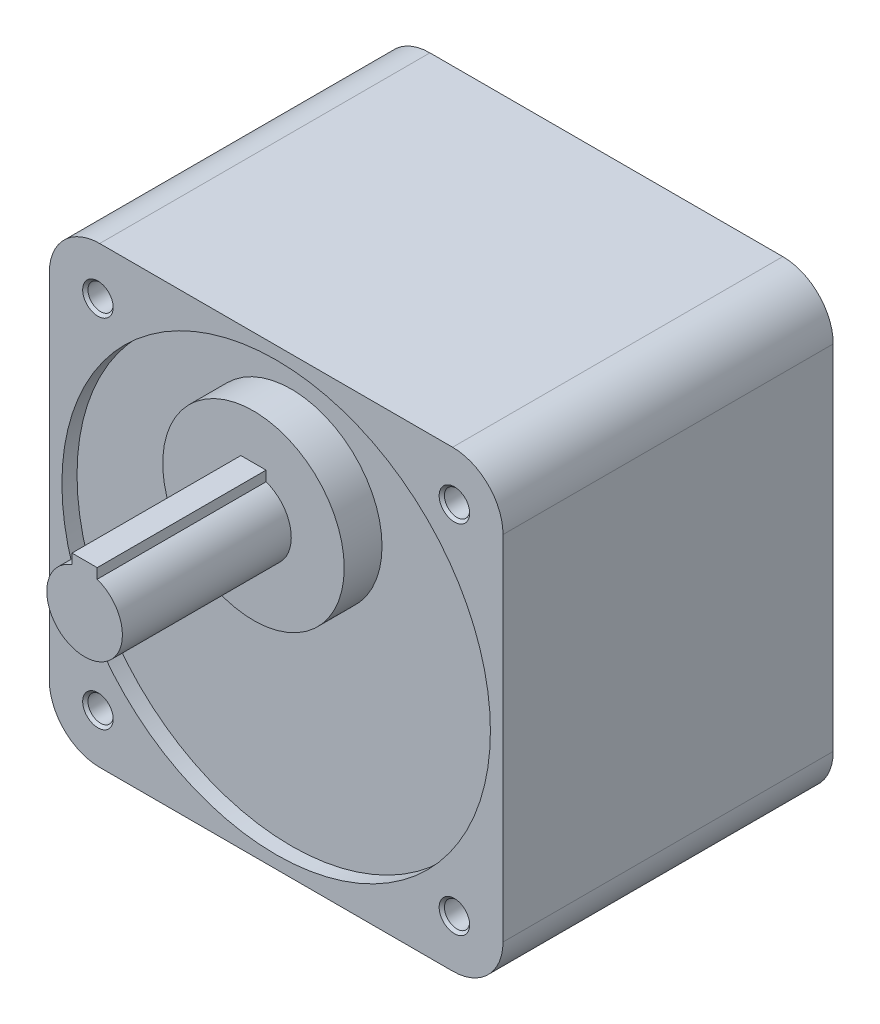
ISO-10303-21;
HEADER;
FILE_DESCRIPTION(('STEP AP214'),'2;1');
FILE_NAME('part.step','',(''),(''),'','','');
FILE_SCHEMA(('AUTOMOTIVE_DESIGN { 1 0 10303 214 1 1 1 1 }'));
ENDSEC;
DATA;
#1=APPLICATION_CONTEXT('core data for automotive mechanical design processes');
#2=APPLICATION_PROTOCOL_DEFINITION('international standard','automotive_design',2000,#1);
#3=PRODUCT_CONTEXT('',#1,'mechanical');
#4=PRODUCT('Part','Part','',(#3));
#5=PRODUCT_RELATED_PRODUCT_CATEGORY('part','',(#4));
#6=PRODUCT_DEFINITION_FORMATION('','',#4);
#7=PRODUCT_DEFINITION_CONTEXT('part definition',#1,'design');
#8=PRODUCT_DEFINITION('design','',#6,#7);
#9=PRODUCT_DEFINITION_SHAPE('','',#8);
#10=(LENGTH_UNIT() NAMED_UNIT(*) SI_UNIT(.MILLI.,.METRE.));
#11=(NAMED_UNIT(*) PLANE_ANGLE_UNIT() SI_UNIT($,.RADIAN.));
#12=(NAMED_UNIT(*) SI_UNIT($,.STERADIAN.) SOLID_ANGLE_UNIT());
#13=UNCERTAINTY_MEASURE_WITH_UNIT(LENGTH_MEASURE(1.E-05),#10,'distance_accuracy_value','');
#14=(GEOMETRIC_REPRESENTATION_CONTEXT(3) GLOBAL_UNCERTAINTY_ASSIGNED_CONTEXT((#13)) GLOBAL_UNIT_ASSIGNED_CONTEXT((#10,
#11,#12)) REPRESENTATION_CONTEXT('',''));
#15=CARTESIAN_POINT('',(0.,0.,0.));
#16=DIRECTION('',(0.,0.,1.));
#17=DIRECTION('',(1.,0.,0.));
#18=AXIS2_PLACEMENT_3D('',#15,#16,#17);
#19=CARTESIAN_POINT('',(0.,0.,65.5));
#20=DIRECTION('',(1.,0.,0.));
#21=DIRECTION('',(0.,1.,0.));
#22=AXIS2_PLACEMENT_3D('',#19,#20,#21);
#23=PLANE('',#22);
#24=DIRECTION('',(0.,-1.,0.));
#25=VECTOR('',#24,1.);
#26=CARTESIAN_POINT('',(0.,0.,0.));
#27=LINE('',#26,#25);
#28=CARTESIAN_POINT('',(0.,-10.,0.));
#29=VERTEX_POINT('',#28);
#30=CARTESIAN_POINT('',(0.,-80.,0.));
#31=VERTEX_POINT('',#30);
#32=EDGE_CURVE('E283',#29,#31,#27,.T.);
#33=ORIENTED_EDGE('',*,*,#32,.T.);
#34=DIRECTION('',(0.,0.,-1.));
#35=VECTOR('',#34,1.);
#36=CARTESIAN_POINT('',(0.,-80.,65.5));
#37=LINE('',#36,#35);
#38=CARTESIAN_POINT('',(0.,-80.,65.5));
#39=VERTEX_POINT('',#38);
#40=EDGE_CURVE('E332',#31,#39,#37,.F.);
#41=ORIENTED_EDGE('',*,*,#40,.T.);
#42=DIRECTION('',(0.,-1.,0.));
#43=VECTOR('',#42,1.);
#44=CARTESIAN_POINT('',(0.,0.,65.5));
#45=LINE('',#44,#43);
#46=CARTESIAN_POINT('',(0.,-10.,65.5));
#47=VERTEX_POINT('',#46);
#48=EDGE_CURVE('E286',#47,#39,#45,.T.);
#49=ORIENTED_EDGE('',*,*,#48,.F.);
#50=DIRECTION('',(0.,0.,-1.));
#51=VECTOR('',#50,1.);
#52=CARTESIAN_POINT('',(0.,-10.,65.5));
#53=LINE('',#52,#51);
#54=EDGE_CURVE('E329',#47,#29,#53,.T.);
#55=ORIENTED_EDGE('',*,*,#54,.T.);
#56=EDGE_LOOP('',(#33,#41,#49,#55));
#57=FACE_BOUND('',#56,.T.);
#58=ADVANCED_FACE('F46',(#57),#23,.F.);
#59=CARTESIAN_POINT('',(0.,-90.,65.5));
#60=DIRECTION('',(0.,1.,0.));
#61=DIRECTION('',(0.,0.,1.));
#62=AXIS2_PLACEMENT_3D('',#59,#60,#61);
#63=PLANE('',#62);
#64=DIRECTION('',(1.,0.,0.));
#65=VECTOR('',#64,1.);
#66=CARTESIAN_POINT('',(0.,-90.,0.));
#67=LINE('',#66,#65);
#68=CARTESIAN_POINT('',(10.,-90.,0.));
#69=VERTEX_POINT('',#68);
#70=CARTESIAN_POINT('',(80.,-90.,0.));
#71=VERTEX_POINT('',#70);
#72=EDGE_CURVE('E298',#69,#71,#67,.T.);
#73=ORIENTED_EDGE('',*,*,#72,.T.);
#74=DIRECTION('',(0.,0.,-1.));
#75=VECTOR('',#74,1.);
#76=CARTESIAN_POINT('',(80.,-90.,65.5));
#77=LINE('',#76,#75);
#78=CARTESIAN_POINT('',(80.,-90.,65.5));
#79=VERTEX_POINT('',#78);
#80=EDGE_CURVE('E320',#71,#79,#77,.F.);
#81=ORIENTED_EDGE('',*,*,#80,.T.);
#82=DIRECTION('',(1.,0.,0.));
#83=VECTOR('',#82,1.);
#84=CARTESIAN_POINT('',(0.,-90.,65.5));
#85=LINE('',#84,#83);
#86=CARTESIAN_POINT('',(10.,-90.,65.5));
#87=VERTEX_POINT('',#86);
#88=EDGE_CURVE('E289',#87,#79,#85,.T.);
#89=ORIENTED_EDGE('',*,*,#88,.F.);
#90=DIRECTION('',(0.,0.,-1.));
#91=VECTOR('',#90,1.);
#92=CARTESIAN_POINT('',(10.,-90.,65.5));
#93=LINE('',#92,#91);
#94=EDGE_CURVE('E317',#87,#69,#93,.T.);
#95=ORIENTED_EDGE('',*,*,#94,.T.);
#96=EDGE_LOOP('',(#73,#81,#89,#95));
#97=FACE_BOUND('',#96,.T.);
#98=ADVANCED_FACE('F347',(#97),#63,.F.);
#99=CARTESIAN_POINT('',(90.,0.,65.5));
#100=DIRECTION('',(-1.,0.,0.));
#101=DIRECTION('',(0.,-1.,0.));
#102=AXIS2_PLACEMENT_3D('',#99,#100,#101);
#103=PLANE('',#102);
#104=DIRECTION('',(0.,1.,0.));
#105=VECTOR('',#104,1.);
#106=CARTESIAN_POINT('',(90.,0.,65.5));
#107=LINE('',#106,#105);
#108=CARTESIAN_POINT('',(90.,-80.,65.5));
#109=VERTEX_POINT('',#108);
#110=CARTESIAN_POINT('',(90.,-9.99999999999999,65.5));
#111=VERTEX_POINT('',#110);
#112=EDGE_CURVE('E293',#109,#111,#107,.T.);
#113=ORIENTED_EDGE('',*,*,#112,.F.);
#114=DIRECTION('',(0.,0.,-1.));
#115=VECTOR('',#114,1.);
#116=CARTESIAN_POINT('',(90.,-80.,65.5));
#117=LINE('',#116,#115);
#118=CARTESIAN_POINT('',(90.,-80.,0.));
#119=VERTEX_POINT('',#118);
#120=EDGE_CURVE('E306',#109,#119,#117,.T.);
#121=ORIENTED_EDGE('',*,*,#120,.T.);
#122=DIRECTION('',(0.,1.,0.));
#123=VECTOR('',#122,1.);
#124=CARTESIAN_POINT('',(90.,0.,0.));
#125=LINE('',#124,#123);
#126=CARTESIAN_POINT('',(90.,-9.99999999999999,0.));
#127=VERTEX_POINT('',#126);
#128=EDGE_CURVE('E301',#119,#127,#125,.T.);
#129=ORIENTED_EDGE('',*,*,#128,.T.);
#130=DIRECTION('',(0.,0.,-1.));
#131=VECTOR('',#130,1.);
#132=CARTESIAN_POINT('',(90.,-10.,65.5));
#133=LINE('',#132,#131);
#134=EDGE_CURVE('E272',#127,#111,#133,.F.);
#135=ORIENTED_EDGE('',*,*,#134,.T.);
#136=EDGE_LOOP('',(#113,#121,#129,#135));
#137=FACE_BOUND('',#136,.T.);
#138=ADVANCED_FACE('F358',(#137),#103,.F.);
#139=CARTESIAN_POINT('',(0.,0.,65.5));
#140=DIRECTION('',(0.,-1.,0.));
#141=DIRECTION('',(0.,0.,-1.));
#142=AXIS2_PLACEMENT_3D('',#139,#140,#141);
#143=PLANE('',#142);
#144=DIRECTION('',(-1.,0.,0.));
#145=VECTOR('',#144,1.);
#146=CARTESIAN_POINT('',(0.,0.,65.5));
#147=LINE('',#146,#145);
#148=CARTESIAN_POINT('',(80.,0.,65.5));
#149=VERTEX_POINT('',#148);
#150=CARTESIAN_POINT('',(10.,0.,65.5));
#151=VERTEX_POINT('',#150);
#152=EDGE_CURVE('E273',#149,#151,#147,.T.);
#153=ORIENTED_EDGE('',*,*,#152,.F.);
#154=DIRECTION('',(0.,0.,-1.));
#155=VECTOR('',#154,1.);
#156=CARTESIAN_POINT('',(80.,0.,65.5));
#157=LINE('',#156,#155);
#158=CARTESIAN_POINT('',(80.,0.,0.));
#159=VERTEX_POINT('',#158);
#160=EDGE_CURVE('E11',#149,#159,#157,.T.);
#161=ORIENTED_EDGE('',*,*,#160,.T.);
#162=DIRECTION('',(-1.,0.,0.));
#163=VECTOR('',#162,1.);
#164=CARTESIAN_POINT('',(0.,0.,0.));
#165=LINE('',#164,#163);
#166=CARTESIAN_POINT('',(10.,0.,0.));
#167=VERTEX_POINT('',#166);
#168=EDGE_CURVE('E290',#159,#167,#165,.T.);
#169=ORIENTED_EDGE('',*,*,#168,.T.);
#170=DIRECTION('',(0.,0.,-1.));
#171=VECTOR('',#170,1.);
#172=CARTESIAN_POINT('',(10.,0.,65.5));
#173=LINE('',#172,#171);
#174=EDGE_CURVE('E54',#167,#151,#173,.F.);
#175=ORIENTED_EDGE('',*,*,#174,.T.);
#176=EDGE_LOOP('',(#153,#161,#169,#175));
#177=FACE_BOUND('',#176,.T.);
#178=ADVANCED_FACE('F364',(#177),#143,.F.);
#179=CARTESIAN_POINT('',(0.,0.,65.5));
#180=DIRECTION('',(0.,0.,1.));
#181=DIRECTION('',(1.,0.,0.));
#182=AXIS2_PLACEMENT_3D('',#179,#180,#181);
#183=PLANE('',#182);
#184=CARTESIAN_POINT('',(9.64466094067262,-9.64466094067262,65.5));
#185=DIRECTION('',(0.,0.,1.));
#186=DIRECTION('',(1.,0.,0.));
#187=AXIS2_PLACEMENT_3D('',#184,#185,#186);
#188=CIRCLE('',#187,3.025);
#189=CARTESIAN_POINT('',(12.6696609406726,-9.64466094067262,65.5));
#190=VERTEX_POINT('',#189);
#191=EDGE_CURVE('E202',#190,#190,#188,.T.);
#192=ORIENTED_EDGE('',*,*,#191,.F.);
#193=EDGE_LOOP('',(#192));
#194=FACE_BOUND('',#193,.T.);
#195=CARTESIAN_POINT('',(80.3553390593274,-9.64466094067262,65.5));
#196=DIRECTION('',(0.,0.,1.));
#197=DIRECTION('',(1.,0.,0.));
#198=AXIS2_PLACEMENT_3D('',#195,#196,#197);
#199=CIRCLE('',#198,3.025);
#200=CARTESIAN_POINT('',(83.3803390593274,-9.64466094067262,65.5));
#201=VERTEX_POINT('',#200);
#202=EDGE_CURVE('E211',#201,#201,#199,.T.);
#203=ORIENTED_EDGE('',*,*,#202,.F.);
#204=EDGE_LOOP('',(#203));
#205=FACE_BOUND('',#204,.T.);
#206=CARTESIAN_POINT('',(9.64466094067262,-80.3553390593274,65.5));
#207=DIRECTION('',(0.,0.,1.));
#208=DIRECTION('',(1.,0.,0.));
#209=AXIS2_PLACEMENT_3D('',#206,#207,#208);
#210=CIRCLE('',#209,3.025);
#211=CARTESIAN_POINT('',(12.6696609406726,-80.3553390593274,65.5));
#212=VERTEX_POINT('',#211);
#213=EDGE_CURVE('E220',#212,#212,#210,.T.);
#214=ORIENTED_EDGE('',*,*,#213,.F.);
#215=EDGE_LOOP('',(#214));
#216=FACE_BOUND('',#215,.T.);
#217=CARTESIAN_POINT('',(80.3553390593274,-80.3553390593274,65.5));
#218=DIRECTION('',(0.,0.,1.));
#219=DIRECTION('',(1.,0.,0.));
#220=AXIS2_PLACEMENT_3D('',#217,#218,#219);
#221=CIRCLE('',#220,3.025);
#222=CARTESIAN_POINT('',(83.3803390593274,-80.3553390593274,65.5));
#223=VERTEX_POINT('',#222);
#224=EDGE_CURVE('E229',#223,#223,#221,.T.);
#225=ORIENTED_EDGE('',*,*,#224,.F.);
#226=EDGE_LOOP('',(#225));
#227=FACE_BOUND('',#226,.T.);
#228=CARTESIAN_POINT('',(45.,-45.,65.5));
#229=DIRECTION('',(0.,0.,1.));
#230=DIRECTION('',(1.,0.,0.));
#231=AXIS2_PLACEMENT_3D('',#228,#229,#230);
#232=CIRCLE('',#231,42.5);
#233=CARTESIAN_POINT('',(87.5,-45.,65.5));
#234=VERTEX_POINT('',#233);
#235=EDGE_CURVE('E277',#234,#234,#232,.T.);
#236=ORIENTED_EDGE('',*,*,#235,.F.);
#237=EDGE_LOOP('',(#236));
#238=FACE_BOUND('',#237,.T.);
#239=ORIENTED_EDGE('',*,*,#88,.T.);
#240=CARTESIAN_POINT('',(80.,-80.,65.5));
#241=DIRECTION('',(0.,0.,1.));
#242=DIRECTION('',(1.,0.,0.));
#243=AXIS2_PLACEMENT_3D('',#240,#241,#242);
#244=CIRCLE('',#243,10.);
#245=EDGE_CURVE('E327',#79,#109,#244,.T.);
#246=ORIENTED_EDGE('',*,*,#245,.T.);
#247=ORIENTED_EDGE('',*,*,#112,.T.);
#248=CARTESIAN_POINT('',(80.,-10.,65.5));
#249=DIRECTION('',(0.,0.,1.));
#250=DIRECTION('',(1.,0.,0.));
#251=AXIS2_PLACEMENT_3D('',#248,#249,#250);
#252=CIRCLE('',#251,10.);
#253=EDGE_CURVE('E67',#111,#149,#252,.T.);
#254=ORIENTED_EDGE('',*,*,#253,.T.);
#255=ORIENTED_EDGE('',*,*,#152,.T.);
#256=CARTESIAN_POINT('',(10.,-10.,65.5));
#257=DIRECTION('',(0.,0.,1.));
#258=DIRECTION('',(1.,0.,0.));
#259=AXIS2_PLACEMENT_3D('',#256,#257,#258);
#260=CIRCLE('',#259,10.);
#261=EDGE_CURVE('E322',#151,#47,#260,.T.);
#262=ORIENTED_EDGE('',*,*,#261,.T.);
#263=ORIENTED_EDGE('',*,*,#48,.T.);
#264=CARTESIAN_POINT('',(10.,-80.,65.5));
#265=DIRECTION('',(0.,0.,1.));
#266=DIRECTION('',(1.,0.,0.));
#267=AXIS2_PLACEMENT_3D('',#264,#265,#266);
#268=CIRCLE('',#267,10.);
#269=EDGE_CURVE('E325',#39,#87,#268,.T.);
#270=ORIENTED_EDGE('',*,*,#269,.T.);
#271=EDGE_LOOP('',(#239,#246,#247,#254,#255,#262,#263,#270));
#272=FACE_BOUND('',#271,.T.);
#273=ADVANCED_FACE('F340',(#194,#205,#216,#227,#238,#272),#183,.T.);
#274=CARTESIAN_POINT('',(0.,0.,0.));
#275=DIRECTION('',(0.,0.,1.));
#276=DIRECTION('',(1.,0.,0.));
#277=AXIS2_PLACEMENT_3D('',#274,#275,#276);
#278=PLANE('',#277);
#279=CARTESIAN_POINT('',(80.3135962701083,-9.68640372989193,0.));
#280=DIRECTION('',(0.,0.,-1.));
#281=DIRECTION('',(-1.,0.,0.));
#282=AXIS2_PLACEMENT_3D('',#279,#280,#281);
#283=CIRCLE('',#282,3.025);
#284=CARTESIAN_POINT('',(77.2885962701083,-9.68640372989193,0.));
#285=VERTEX_POINT('',#284);
#286=EDGE_CURVE('E175',#285,#285,#283,.T.);
#287=ORIENTED_EDGE('',*,*,#286,.F.);
#288=EDGE_LOOP('',(#287));
#289=FACE_BOUND('',#288,.T.);
#290=CARTESIAN_POINT('',(9.60296737759219,-9.60296737759219,0.));
#291=DIRECTION('',(0.,0.,-1.));
#292=DIRECTION('',(-1.,0.,0.));
#293=AXIS2_PLACEMENT_3D('',#290,#291,#292);
#294=CIRCLE('',#293,3.025);
#295=CARTESIAN_POINT('',(6.57796737759219,-9.60296737759219,0.));
#296=VERTEX_POINT('',#295);
#297=EDGE_CURVE('E168',#296,#296,#294,.T.);
#298=ORIENTED_EDGE('',*,*,#297,.F.);
#299=EDGE_LOOP('',(#298));
#300=FACE_BOUND('',#299,.T.);
#301=CARTESIAN_POINT('',(80.3135962701082,-80.3135962701081,0.));
#302=DIRECTION('',(0.,0.,-1.));
#303=DIRECTION('',(-1.,0.,0.));
#304=AXIS2_PLACEMENT_3D('',#301,#302,#303);
#305=CIRCLE('',#304,3.025);
#306=CARTESIAN_POINT('',(77.2885962701082,-80.3135962701081,0.));
#307=VERTEX_POINT('',#306);
#308=EDGE_CURVE('E184',#307,#307,#305,.T.);
#309=ORIENTED_EDGE('',*,*,#308,.F.);
#310=EDGE_LOOP('',(#309));
#311=FACE_BOUND('',#310,.T.);
#312=CARTESIAN_POINT('',(9.60296737759221,-80.3970326224078,0.));
#313=DIRECTION('',(0.,0.,-1.));
#314=DIRECTION('',(-1.,0.,0.));
#315=AXIS2_PLACEMENT_3D('',#312,#313,#314);
#316=CIRCLE('',#315,3.025);
#317=CARTESIAN_POINT('',(6.57796737759221,-80.3970326224078,0.));
#318=VERTEX_POINT('',#317);
#319=EDGE_CURVE('E193',#318,#318,#316,.T.);
#320=ORIENTED_EDGE('',*,*,#319,.F.);
#321=EDGE_LOOP('',(#320));
#322=FACE_BOUND('',#321,.T.);
#323=ORIENTED_EDGE('',*,*,#128,.F.);
#324=CARTESIAN_POINT('',(80.,-80.,0.));
#325=DIRECTION('',(0.,0.,1.));
#326=DIRECTION('',(1.,0.,0.));
#327=AXIS2_PLACEMENT_3D('',#324,#325,#326);
#328=CIRCLE('',#327,10.);
#329=EDGE_CURVE('E315',#119,#71,#328,.F.);
#330=ORIENTED_EDGE('',*,*,#329,.T.);
#331=ORIENTED_EDGE('',*,*,#72,.F.);
#332=CARTESIAN_POINT('',(10.,-80.,0.));
#333=DIRECTION('',(0.,0.,1.));
#334=DIRECTION('',(1.,0.,0.));
#335=AXIS2_PLACEMENT_3D('',#332,#333,#334);
#336=CIRCLE('',#335,10.);
#337=EDGE_CURVE('E313',#69,#31,#336,.F.);
#338=ORIENTED_EDGE('',*,*,#337,.T.);
#339=ORIENTED_EDGE('',*,*,#32,.F.);
#340=CARTESIAN_POINT('',(10.,-10.,0.));
#341=DIRECTION('',(0.,0.,1.));
#342=DIRECTION('',(1.,0.,0.));
#343=AXIS2_PLACEMENT_3D('',#340,#341,#342);
#344=CIRCLE('',#343,10.);
#345=EDGE_CURVE('E309',#29,#167,#344,.F.);
#346=ORIENTED_EDGE('',*,*,#345,.T.);
#347=ORIENTED_EDGE('',*,*,#168,.F.);
#348=CARTESIAN_POINT('',(80.,-10.,0.));
#349=DIRECTION('',(0.,0.,1.));
#350=DIRECTION('',(1.,0.,0.));
#351=AXIS2_PLACEMENT_3D('',#348,#349,#350);
#352=CIRCLE('',#351,10.);
#353=EDGE_CURVE('E311',#159,#127,#352,.F.);
#354=ORIENTED_EDGE('',*,*,#353,.T.);
#355=EDGE_LOOP('',(#323,#330,#331,#338,#339,#346,#347,#354));
#356=FACE_BOUND('',#355,.T.);
#357=ADVANCED_FACE('F351',(#289,#300,#311,#322,#356),#278,.F.);
#358=CARTESIAN_POINT('',(45.,-45.,62.5));
#359=DIRECTION('',(0.,0.,1.));
#360=DIRECTION('',(1.,0.,0.));
#361=AXIS2_PLACEMENT_3D('',#358,#359,#360);
#362=CYLINDRICAL_SURFACE('',#361,42.5);
#363=CARTESIAN_POINT('',(45.,-45.,62.5));
#364=DIRECTION('',(0.,0.,1.));
#365=DIRECTION('',(1.,0.,0.));
#366=AXIS2_PLACEMENT_3D('',#363,#364,#365);
#367=CIRCLE('',#366,42.5);
#368=CARTESIAN_POINT('',(87.5,-45.,62.5));
#369=VERTEX_POINT('',#368);
#370=EDGE_CURVE('E280',#369,#369,#367,.T.);
#371=ORIENTED_EDGE('',*,*,#370,.F.);
#372=EDGE_LOOP('',(#371));
#373=FACE_BOUND('',#372,.T.);
#374=ORIENTED_EDGE('',*,*,#235,.T.);
#375=EDGE_LOOP('',(#374));
#376=FACE_BOUND('',#375,.T.);
#377=ADVANCED_FACE('F603',(#373,#376),#362,.F.);
#378=CARTESIAN_POINT('',(45.,-45.,62.5));
#379=DIRECTION('',(0.,0.,1.));
#380=DIRECTION('',(1.,0.,0.));
#381=AXIS2_PLACEMENT_3D('',#378,#379,#380);
#382=PLANE('',#381);
#383=CARTESIAN_POINT('',(45.,-27.,62.5));
#384=DIRECTION('',(0.,0.,1.));
#385=DIRECTION('',(1.,0.,0.));
#386=AXIS2_PLACEMENT_3D('',#383,#384,#385);
#387=CIRCLE('',#386,18.);
#388=CARTESIAN_POINT('',(63.,-27.,62.5));
#389=VERTEX_POINT('',#388);
#390=EDGE_CURVE('E268',#389,#389,#387,.T.);
#391=ORIENTED_EDGE('',*,*,#390,.F.);
#392=EDGE_LOOP('',(#391));
#393=FACE_BOUND('',#392,.T.);
#394=ORIENTED_EDGE('',*,*,#370,.T.);
#395=EDGE_LOOP('',(#394));
#396=FACE_BOUND('',#395,.T.);
#397=ADVANCED_FACE('F599',(#393,#396),#382,.T.);
#398=CARTESIAN_POINT('',(45.,-27.,70.));
#399=DIRECTION('',(0.,0.,-1.));
#400=DIRECTION('',(-1.,0.,0.));
#401=AXIS2_PLACEMENT_3D('',#398,#399,#400);
#402=CYLINDRICAL_SURFACE('',#401,18.);
#403=CARTESIAN_POINT('',(45.,-27.,70.));
#404=DIRECTION('',(0.,0.,1.));
#405=DIRECTION('',(1.,0.,0.));
#406=AXIS2_PLACEMENT_3D('',#403,#404,#405);
#407=CIRCLE('',#406,18.);
#408=CARTESIAN_POINT('',(63.,-27.,70.));
#409=VERTEX_POINT('',#408);
#410=EDGE_CURVE('E274',#409,#409,#407,.T.);
#411=ORIENTED_EDGE('',*,*,#410,.F.);
#412=EDGE_LOOP('',(#411));
#413=FACE_BOUND('',#412,.T.);
#414=ORIENTED_EDGE('',*,*,#390,.T.);
#415=EDGE_LOOP('',(#414));
#416=FACE_BOUND('',#415,.T.);
#417=ADVANCED_FACE('F595',(#413,#416),#402,.T.);
#418=CARTESIAN_POINT('',(45.,-27.,70.));
#419=DIRECTION('',(0.,0.,1.));
#420=DIRECTION('',(1.,0.,0.));
#421=AXIS2_PLACEMENT_3D('',#418,#419,#420);
#422=PLANE('',#421);
#423=DIRECTION('',(0.,1.,0.));
#424=VECTOR('',#423,1.);
#425=CARTESIAN_POINT('',(42.5,-19.9289321881345,70.));
#426=LINE('',#425,#424);
#427=CARTESIAN_POINT('',(42.5,-19.9289321881345,70.));
#428=VERTEX_POINT('',#427);
#429=CARTESIAN_POINT('',(42.5,-17.9289321881345,70.));
#430=VERTEX_POINT('',#429);
#431=EDGE_CURVE('E238',#428,#430,#426,.T.);
#432=ORIENTED_EDGE('',*,*,#431,.T.);
#433=DIRECTION('',(1.,0.,0.));
#434=VECTOR('',#433,1.);
#435=CARTESIAN_POINT('',(42.5,-17.9289321881345,70.));
#436=LINE('',#435,#434);
#437=CARTESIAN_POINT('',(47.5,-17.9289321881345,70.));
#438=VERTEX_POINT('',#437);
#439=EDGE_CURVE('E261',#430,#438,#436,.T.);
#440=ORIENTED_EDGE('',*,*,#439,.T.);
#441=DIRECTION('',(0.,-1.,0.));
#442=VECTOR('',#441,1.);
#443=CARTESIAN_POINT('',(47.5,-19.9289321881345,70.));
#444=LINE('',#443,#442);
#445=CARTESIAN_POINT('',(47.5,-19.9289321881345,70.));
#446=VERTEX_POINT('',#445);
#447=EDGE_CURVE('E253',#438,#446,#444,.T.);
#448=ORIENTED_EDGE('',*,*,#447,.T.);
#449=CARTESIAN_POINT('',(45.,-27.,70.));
#450=DIRECTION('',(0.,0.,1.));
#451=DIRECTION('',(1.,0.,0.));
#452=AXIS2_PLACEMENT_3D('',#449,#450,#451);
#453=CIRCLE('',#452,7.5);
#454=EDGE_CURVE('E269',#428,#446,#453,.T.);
#455=ORIENTED_EDGE('',*,*,#454,.F.);
#456=EDGE_LOOP('',(#432,#440,#448,#455));
#457=FACE_BOUND('',#456,.T.);
#458=ORIENTED_EDGE('',*,*,#410,.T.);
#459=EDGE_LOOP('',(#458));
#460=FACE_BOUND('',#459,.T.);
#461=ADVANCED_FACE('F591',(#457,#460),#422,.T.);
#462=CARTESIAN_POINT('',(45.,-27.,103.5));
#463=DIRECTION('',(0.,0.,-1.));
#464=DIRECTION('',(-1.,0.,0.));
#465=AXIS2_PLACEMENT_3D('',#462,#463,#464);
#466=CYLINDRICAL_SURFACE('',#465,7.5);
#467=CARTESIAN_POINT('',(45.,-27.,103.5));
#468=DIRECTION('',(0.,0.,1.));
#469=DIRECTION('',(1.,0.,0.));
#470=AXIS2_PLACEMENT_3D('',#467,#468,#469);
#471=CIRCLE('',#470,7.5);
#472=CARTESIAN_POINT('',(42.5,-19.9289321881345,103.5));
#473=VERTEX_POINT('',#472);
#474=CARTESIAN_POINT('',(47.5,-19.9289321881345,103.5));
#475=VERTEX_POINT('',#474);
#476=EDGE_CURVE('E241',#473,#475,#471,.T.);
#477=ORIENTED_EDGE('',*,*,#476,.F.);
#478=DIRECTION('',(0.,0.,1.));
#479=VECTOR('',#478,1.);
#480=CARTESIAN_POINT('',(42.5,-19.9289321881345,-0.002000000000002));
#481=LINE('',#480,#479);
#482=EDGE_CURVE('E248',#428,#473,#481,.T.);
#483=ORIENTED_EDGE('',*,*,#482,.F.);
#484=ORIENTED_EDGE('',*,*,#454,.T.);
#485=DIRECTION('',(0.,0.,1.));
#486=VECTOR('',#485,1.);
#487=CARTESIAN_POINT('',(47.5,-19.9289321881345,-0.002000000000002));
#488=LINE('',#487,#486);
#489=EDGE_CURVE('E249',#446,#475,#488,.T.);
#490=ORIENTED_EDGE('',*,*,#489,.T.);
#491=EDGE_LOOP('',(#477,#483,#484,#490));
#492=FACE_BOUND('',#491,.T.);
#493=ADVANCED_FACE('F587',(#492),#466,.T.);
#494=CARTESIAN_POINT('',(45.,-27.,103.5));
#495=DIRECTION('',(0.,0.,1.));
#496=DIRECTION('',(1.,0.,0.));
#497=AXIS2_PLACEMENT_3D('',#494,#495,#496);
#498=PLANE('',#497);
#499=ORIENTED_EDGE('',*,*,#476,.T.);
#500=DIRECTION('',(0.,1.,0.));
#501=VECTOR('',#500,1.);
#502=CARTESIAN_POINT('',(47.5,-19.9289321881345,103.5));
#503=LINE('',#502,#501);
#504=CARTESIAN_POINT('',(47.5,-17.9289321881345,103.5));
#505=VERTEX_POINT('',#504);
#506=EDGE_CURVE('E245',#475,#505,#503,.T.);
#507=ORIENTED_EDGE('',*,*,#506,.T.);
#508=DIRECTION('',(-1.,0.,0.));
#509=VECTOR('',#508,1.);
#510=CARTESIAN_POINT('',(42.5,-17.9289321881345,103.5));
#511=LINE('',#510,#509);
#512=CARTESIAN_POINT('',(42.5,-17.9289321881345,103.5));
#513=VERTEX_POINT('',#512);
#514=EDGE_CURVE('E242',#505,#513,#511,.T.);
#515=ORIENTED_EDGE('',*,*,#514,.T.);
#516=DIRECTION('',(0.,-1.,0.));
#517=VECTOR('',#516,1.);
#518=CARTESIAN_POINT('',(42.5,-19.9289321881345,103.5));
#519=LINE('',#518,#517);
#520=EDGE_CURVE('E239',#513,#473,#519,.T.);
#521=ORIENTED_EDGE('',*,*,#520,.T.);
#522=EDGE_LOOP('',(#499,#507,#515,#521));
#523=FACE_BOUND('',#522,.T.);
#524=ADVANCED_FACE('F578',(#523),#498,.T.);
#525=CARTESIAN_POINT('',(42.5,-19.9289321881345,-0.002000000000002));
#526=DIRECTION('',(-1.,0.,0.));
#527=DIRECTION('',(0.,0.,1.));
#528=AXIS2_PLACEMENT_3D('',#525,#526,#527);
#529=PLANE('',#528);
#530=ORIENTED_EDGE('',*,*,#431,.F.);
#531=ORIENTED_EDGE('',*,*,#482,.T.);
#532=ORIENTED_EDGE('',*,*,#520,.F.);
#533=DIRECTION('',(0.,0.,1.));
#534=VECTOR('',#533,1.);
#535=CARTESIAN_POINT('',(42.5,-17.9289321881345,-0.002000000000002));
#536=LINE('',#535,#534);
#537=EDGE_CURVE('E255',#430,#513,#536,.T.);
#538=ORIENTED_EDGE('',*,*,#537,.F.);
#539=EDGE_LOOP('',(#530,#531,#532,#538));
#540=FACE_BOUND('',#539,.T.);
#541=ADVANCED_FACE('F573',(#540),#529,.T.);
#542=CARTESIAN_POINT('',(42.5,-17.9289321881345,-0.002000000000002));
#543=DIRECTION('',(0.,1.,0.));
#544=DIRECTION('',(0.,0.,1.));
#545=AXIS2_PLACEMENT_3D('',#542,#543,#544);
#546=PLANE('',#545);
#547=ORIENTED_EDGE('',*,*,#439,.F.);
#548=ORIENTED_EDGE('',*,*,#537,.T.);
#549=ORIENTED_EDGE('',*,*,#514,.F.);
#550=DIRECTION('',(0.,0.,1.));
#551=VECTOR('',#550,1.);
#552=CARTESIAN_POINT('',(47.5,-17.9289321881345,-0.002000000000002));
#553=LINE('',#552,#551);
#554=EDGE_CURVE('E252',#438,#505,#553,.T.);
#555=ORIENTED_EDGE('',*,*,#554,.F.);
#556=EDGE_LOOP('',(#547,#548,#549,#555));
#557=FACE_BOUND('',#556,.T.);
#558=ADVANCED_FACE('F576',(#557),#546,.T.);
#559=CARTESIAN_POINT('',(47.5,-19.9289321881345,-0.002000000000002));
#560=DIRECTION('',(1.,0.,0.));
#561=DIRECTION('',(0.,0.,-1.));
#562=AXIS2_PLACEMENT_3D('',#559,#560,#561);
#563=PLANE('',#562);
#564=ORIENTED_EDGE('',*,*,#447,.F.);
#565=ORIENTED_EDGE('',*,*,#554,.T.);
#566=ORIENTED_EDGE('',*,*,#506,.F.);
#567=ORIENTED_EDGE('',*,*,#489,.F.);
#568=EDGE_LOOP('',(#564,#565,#566,#567));
#569=FACE_BOUND('',#568,.T.);
#570=ADVANCED_FACE('F571',(#569),#563,.T.);
#571=CARTESIAN_POINT('',(80.3553390593274,-80.3553390593274,48.5));
#572=DIRECTION('',(0.,0.,1.));
#573=DIRECTION('',(1.,0.,0.));
#574=AXIS2_PLACEMENT_3D('',#571,#572,#573);
#575=CONICAL_SURFACE('',#574,2.49999999999999,1.02974425867665);
#576=CARTESIAN_POINT('',(80.3553390593274,-80.3553390593274,46.9978484524311));
#577=VERTEX_POINT('',#576);
#578=VERTEX_LOOP('',#577);
#579=FACE_BOUND('',#578,.T.);
#580=CARTESIAN_POINT('',(80.3553390593274,-80.3553390593274,48.5));
#581=DIRECTION('',(0.,0.,1.));
#582=DIRECTION('',(1.,0.,0.));
#583=AXIS2_PLACEMENT_3D('',#580,#581,#582);
#584=CIRCLE('',#583,2.49999999999999);
#585=CARTESIAN_POINT('',(82.8553390593274,-80.3553390593274,48.5));
#586=VERTEX_POINT('',#585);
#587=EDGE_CURVE('E235',#586,#586,#584,.T.);
#588=ORIENTED_EDGE('',*,*,#587,.T.);
#589=EDGE_LOOP('',(#588));
#590=FACE_BOUND('',#589,.T.);
#591=ADVANCED_FACE('F567',(#579,#590),#575,.F.);
#592=CARTESIAN_POINT('',(80.3553390593274,-80.3553390593274,65.5));
#593=DIRECTION('',(0.,0.,1.));
#594=DIRECTION('',(1.,0.,0.));
#595=AXIS2_PLACEMENT_3D('',#592,#593,#594);
#596=CYLINDRICAL_SURFACE('',#595,2.5);
#597=ORIENTED_EDGE('',*,*,#587,.F.);
#598=EDGE_LOOP('',(#597));
#599=FACE_BOUND('',#598,.T.);
#600=CARTESIAN_POINT('',(80.3553390593274,-80.3553390593274,64.975));
#601=DIRECTION('',(0.,0.,1.));
#602=DIRECTION('',(1.,0.,0.));
#603=AXIS2_PLACEMENT_3D('',#600,#601,#602);
#604=CIRCLE('',#603,2.5);
#605=CARTESIAN_POINT('',(82.8553390593274,-80.3553390593274,64.975));
#606=VERTEX_POINT('',#605);
#607=EDGE_CURVE('E232',#606,#606,#604,.T.);
#608=ORIENTED_EDGE('',*,*,#607,.T.);
#609=EDGE_LOOP('',(#608));
#610=FACE_BOUND('',#609,.T.);
#611=ADVANCED_FACE('F563',(#599,#610),#596,.F.);
#612=CARTESIAN_POINT('',(80.3553390593274,-80.3553390593274,65.5));
#613=DIRECTION('',(0.,0.,1.));
#614=DIRECTION('',(1.,0.,0.));
#615=AXIS2_PLACEMENT_3D('',#612,#613,#614);
#616=CONICAL_SURFACE('',#615,3.025,0.785398163397448);
#617=ORIENTED_EDGE('',*,*,#607,.F.);
#618=EDGE_LOOP('',(#617));
#619=FACE_BOUND('',#618,.T.);
#620=ORIENTED_EDGE('',*,*,#224,.T.);
#621=EDGE_LOOP('',(#620));
#622=FACE_BOUND('',#621,.T.);
#623=ADVANCED_FACE('F559',(#619,#622),#616,.F.);
#624=CARTESIAN_POINT('',(9.64466094067262,-80.3553390593274,48.5));
#625=DIRECTION('',(0.,0.,1.));
#626=DIRECTION('',(1.,0.,0.));
#627=AXIS2_PLACEMENT_3D('',#624,#625,#626);
#628=CONICAL_SURFACE('',#627,2.49999999999999,1.02974425867665);
#629=CARTESIAN_POINT('',(9.64466094067262,-80.3553390593274,46.9978484524311));
#630=VERTEX_POINT('',#629);
#631=VERTEX_LOOP('',#630);
#632=FACE_BOUND('',#631,.T.);
#633=CARTESIAN_POINT('',(9.64466094067262,-80.3553390593274,48.5));
#634=DIRECTION('',(0.,0.,1.));
#635=DIRECTION('',(1.,0.,0.));
#636=AXIS2_PLACEMENT_3D('',#633,#634,#635);
#637=CIRCLE('',#636,2.49999999999999);
#638=CARTESIAN_POINT('',(12.1446609406726,-80.3553390593274,48.5));
#639=VERTEX_POINT('',#638);
#640=EDGE_CURVE('E226',#639,#639,#637,.T.);
#641=ORIENTED_EDGE('',*,*,#640,.T.);
#642=EDGE_LOOP('',(#641));
#643=FACE_BOUND('',#642,.T.);
#644=ADVANCED_FACE('F555',(#632,#643),#628,.F.);
#645=CARTESIAN_POINT('',(9.64466094067262,-80.3553390593274,65.5));
#646=DIRECTION('',(0.,0.,1.));
#647=DIRECTION('',(1.,0.,0.));
#648=AXIS2_PLACEMENT_3D('',#645,#646,#647);
#649=CYLINDRICAL_SURFACE('',#648,2.49999999999999);
#650=ORIENTED_EDGE('',*,*,#640,.F.);
#651=EDGE_LOOP('',(#650));
#652=FACE_BOUND('',#651,.T.);
#653=CARTESIAN_POINT('',(9.64466094067262,-80.3553390593274,64.975));
#654=DIRECTION('',(0.,0.,1.));
#655=DIRECTION('',(1.,0.,0.));
#656=AXIS2_PLACEMENT_3D('',#653,#654,#655);
#657=CIRCLE('',#656,2.5);
#658=CARTESIAN_POINT('',(12.1446609406726,-80.3553390593274,64.975));
#659=VERTEX_POINT('',#658);
#660=EDGE_CURVE('E223',#659,#659,#657,.T.);
#661=ORIENTED_EDGE('',*,*,#660,.T.);
#662=EDGE_LOOP('',(#661));
#663=FACE_BOUND('',#662,.T.);
#664=ADVANCED_FACE('F551',(#652,#663),#649,.F.);
#665=CARTESIAN_POINT('',(9.64466094067262,-80.3553390593274,65.5));
#666=DIRECTION('',(0.,0.,1.));
#667=DIRECTION('',(1.,0.,0.));
#668=AXIS2_PLACEMENT_3D('',#665,#666,#667);
#669=CONICAL_SURFACE('',#668,3.025,0.785398163397452);
#670=ORIENTED_EDGE('',*,*,#660,.F.);
#671=EDGE_LOOP('',(#670));
#672=FACE_BOUND('',#671,.T.);
#673=ORIENTED_EDGE('',*,*,#213,.T.);
#674=EDGE_LOOP('',(#673));
#675=FACE_BOUND('',#674,.T.);
#676=ADVANCED_FACE('F547',(#672,#675),#669,.F.);
#677=CARTESIAN_POINT('',(80.3553390593274,-9.64466094067262,48.5));
#678=DIRECTION('',(0.,0.,1.));
#679=DIRECTION('',(1.,0.,0.));
#680=AXIS2_PLACEMENT_3D('',#677,#678,#679);
#681=CONICAL_SURFACE('',#680,2.49999999999999,1.02974425867665);
#682=CARTESIAN_POINT('',(80.3553390593274,-9.64466094067262,46.9978484524311));
#683=VERTEX_POINT('',#682);
#684=VERTEX_LOOP('',#683);
#685=FACE_BOUND('',#684,.T.);
#686=CARTESIAN_POINT('',(80.3553390593274,-9.64466094067262,48.5));
#687=DIRECTION('',(0.,0.,1.));
#688=DIRECTION('',(1.,0.,0.));
#689=AXIS2_PLACEMENT_3D('',#686,#687,#688);
#690=CIRCLE('',#689,2.49999999999999);
#691=CARTESIAN_POINT('',(82.8553390593274,-9.64466094067262,48.5));
#692=VERTEX_POINT('',#691);
#693=EDGE_CURVE('E217',#692,#692,#690,.T.);
#694=ORIENTED_EDGE('',*,*,#693,.T.);
#695=EDGE_LOOP('',(#694));
#696=FACE_BOUND('',#695,.T.);
#697=ADVANCED_FACE('F543',(#685,#696),#681,.F.);
#698=CARTESIAN_POINT('',(80.3553390593274,-9.64466094067262,65.5));
#699=DIRECTION('',(0.,0.,1.));
#700=DIRECTION('',(1.,0.,0.));
#701=AXIS2_PLACEMENT_3D('',#698,#699,#700);
#702=CYLINDRICAL_SURFACE('',#701,2.5);
#703=ORIENTED_EDGE('',*,*,#693,.F.);
#704=EDGE_LOOP('',(#703));
#705=FACE_BOUND('',#704,.T.);
#706=CARTESIAN_POINT('',(80.3553390593274,-9.64466094067262,64.975));
#707=DIRECTION('',(0.,0.,1.));
#708=DIRECTION('',(1.,0.,0.));
#709=AXIS2_PLACEMENT_3D('',#706,#707,#708);
#710=CIRCLE('',#709,2.5);
#711=CARTESIAN_POINT('',(82.8553390593274,-9.64466094067262,64.975));
#712=VERTEX_POINT('',#711);
#713=EDGE_CURVE('E214',#712,#712,#710,.T.);
#714=ORIENTED_EDGE('',*,*,#713,.T.);
#715=EDGE_LOOP('',(#714));
#716=FACE_BOUND('',#715,.T.);
#717=ADVANCED_FACE('F539',(#705,#716),#702,.F.);
#718=CARTESIAN_POINT('',(80.3553390593274,-9.64466094067262,65.5));
#719=DIRECTION('',(0.,0.,1.));
#720=DIRECTION('',(1.,0.,0.));
#721=AXIS2_PLACEMENT_3D('',#718,#719,#720);
#722=CONICAL_SURFACE('',#721,3.025,0.785398163397448);
#723=ORIENTED_EDGE('',*,*,#713,.F.);
#724=EDGE_LOOP('',(#723));
#725=FACE_BOUND('',#724,.T.);
#726=ORIENTED_EDGE('',*,*,#202,.T.);
#727=EDGE_LOOP('',(#726));
#728=FACE_BOUND('',#727,.T.);
#729=ADVANCED_FACE('F535',(#725,#728),#722,.F.);
#730=CARTESIAN_POINT('',(9.64466094067262,-9.64466094067262,48.5));
#731=DIRECTION('',(0.,0.,1.));
#732=DIRECTION('',(1.,0.,0.));
#733=AXIS2_PLACEMENT_3D('',#730,#731,#732);
#734=CONICAL_SURFACE('',#733,2.49999999999999,1.02974425867665);
#735=CARTESIAN_POINT('',(9.64466094067261,-9.64466094067262,46.9978484524311));
#736=VERTEX_POINT('',#735);
#737=VERTEX_LOOP('',#736);
#738=FACE_BOUND('',#737,.T.);
#739=CARTESIAN_POINT('',(9.64466094067262,-9.64466094067262,48.5));
#740=DIRECTION('',(0.,0.,1.));
#741=DIRECTION('',(1.,0.,0.));
#742=AXIS2_PLACEMENT_3D('',#739,#740,#741);
#743=CIRCLE('',#742,2.49999999999999);
#744=CARTESIAN_POINT('',(12.1446609406726,-9.64466094067262,48.5));
#745=VERTEX_POINT('',#744);
#746=EDGE_CURVE('E208',#745,#745,#743,.T.);
#747=ORIENTED_EDGE('',*,*,#746,.T.);
#748=EDGE_LOOP('',(#747));
#749=FACE_BOUND('',#748,.T.);
#750=ADVANCED_FACE('F531',(#738,#749),#734,.F.);
#751=CARTESIAN_POINT('',(9.64466094067262,-9.64466094067262,65.5));
#752=DIRECTION('',(0.,0.,1.));
#753=DIRECTION('',(1.,0.,0.));
#754=AXIS2_PLACEMENT_3D('',#751,#752,#753);
#755=CYLINDRICAL_SURFACE('',#754,2.49999999999999);
#756=ORIENTED_EDGE('',*,*,#746,.F.);
#757=EDGE_LOOP('',(#756));
#758=FACE_BOUND('',#757,.T.);
#759=CARTESIAN_POINT('',(9.64466094067262,-9.64466094067262,64.975));
#760=DIRECTION('',(0.,0.,1.));
#761=DIRECTION('',(1.,0.,0.));
#762=AXIS2_PLACEMENT_3D('',#759,#760,#761);
#763=CIRCLE('',#762,2.5);
#764=CARTESIAN_POINT('',(12.1446609406726,-9.64466094067262,64.975));
#765=VERTEX_POINT('',#764);
#766=EDGE_CURVE('E205',#765,#765,#763,.T.);
#767=ORIENTED_EDGE('',*,*,#766,.T.);
#768=EDGE_LOOP('',(#767));
#769=FACE_BOUND('',#768,.T.);
#770=ADVANCED_FACE('F527',(#758,#769),#755,.F.);
#771=CARTESIAN_POINT('',(9.64466094067262,-9.64466094067262,65.5));
#772=DIRECTION('',(0.,0.,1.));
#773=DIRECTION('',(1.,0.,0.));
#774=AXIS2_PLACEMENT_3D('',#771,#772,#773);
#775=CONICAL_SURFACE('',#774,3.025,0.785398163397452);
#776=ORIENTED_EDGE('',*,*,#766,.F.);
#777=EDGE_LOOP('',(#776));
#778=FACE_BOUND('',#777,.T.);
#779=ORIENTED_EDGE('',*,*,#191,.T.);
#780=EDGE_LOOP('',(#779));
#781=FACE_BOUND('',#780,.T.);
#782=ADVANCED_FACE('F387',(#778,#781),#775,.F.);
#783=CARTESIAN_POINT('',(80.,-80.,65.5));
#784=DIRECTION('',(0.,0.,-1.));
#785=DIRECTION('',(-1.,0.,0.));
#786=AXIS2_PLACEMENT_3D('',#783,#784,#785);
#787=CYLINDRICAL_SURFACE('',#786,10.);
#788=ORIENTED_EDGE('',*,*,#245,.F.);
#789=ORIENTED_EDGE('',*,*,#80,.F.);
#790=ORIENTED_EDGE('',*,*,#329,.F.);
#791=ORIENTED_EDGE('',*,*,#120,.F.);
#792=EDGE_LOOP('',(#788,#789,#790,#791));
#793=FACE_BOUND('',#792,.T.);
#794=ADVANCED_FACE('F355',(#793),#787,.T.);
#795=CARTESIAN_POINT('',(10.,-80.,65.5));
#796=DIRECTION('',(0.,0.,-1.));
#797=DIRECTION('',(-1.,0.,0.));
#798=AXIS2_PLACEMENT_3D('',#795,#796,#797);
#799=CYLINDRICAL_SURFACE('',#798,10.);
#800=ORIENTED_EDGE('',*,*,#269,.F.);
#801=ORIENTED_EDGE('',*,*,#40,.F.);
#802=ORIENTED_EDGE('',*,*,#337,.F.);
#803=ORIENTED_EDGE('',*,*,#94,.F.);
#804=EDGE_LOOP('',(#800,#801,#802,#803));
#805=FACE_BOUND('',#804,.T.);
#806=ADVANCED_FACE('F344',(#805),#799,.T.);
#807=CARTESIAN_POINT('',(80.,-10.,65.5));
#808=DIRECTION('',(0.,0.,-1.));
#809=DIRECTION('',(-1.,0.,0.));
#810=AXIS2_PLACEMENT_3D('',#807,#808,#809);
#811=CYLINDRICAL_SURFACE('',#810,10.);
#812=ORIENTED_EDGE('',*,*,#253,.F.);
#813=ORIENTED_EDGE('',*,*,#134,.F.);
#814=ORIENTED_EDGE('',*,*,#353,.F.);
#815=ORIENTED_EDGE('',*,*,#160,.F.);
#816=EDGE_LOOP('',(#812,#813,#814,#815));
#817=FACE_BOUND('',#816,.T.);
#818=ADVANCED_FACE('F362',(#817),#811,.T.);
#819=CARTESIAN_POINT('',(10.,-10.,65.5));
#820=DIRECTION('',(0.,0.,-1.));
#821=DIRECTION('',(-1.,0.,0.));
#822=AXIS2_PLACEMENT_3D('',#819,#820,#821);
#823=CYLINDRICAL_SURFACE('',#822,10.);
#824=ORIENTED_EDGE('',*,*,#261,.F.);
#825=ORIENTED_EDGE('',*,*,#174,.F.);
#826=ORIENTED_EDGE('',*,*,#345,.F.);
#827=ORIENTED_EDGE('',*,*,#54,.F.);
#828=EDGE_LOOP('',(#824,#825,#826,#827));
#829=FACE_BOUND('',#828,.T.);
#830=ADVANCED_FACE('F48',(#829),#823,.T.);
#831=CARTESIAN_POINT('',(9.60296737759221,-80.3970326224078,17.));
#832=DIRECTION('',(0.,0.,-1.));
#833=DIRECTION('',(-1.,0.,0.));
#834=AXIS2_PLACEMENT_3D('',#831,#832,#833);
#835=CONICAL_SURFACE('',#834,2.49999999999999,1.02974425867665);
#836=CARTESIAN_POINT('',(9.6029673775922,-80.3970326224078,18.5021515475689));
#837=VERTEX_POINT('',#836);
#838=VERTEX_LOOP('',#837);
#839=FACE_BOUND('',#838,.T.);
#840=CARTESIAN_POINT('',(9.60296737759221,-80.3970326224078,17.));
#841=DIRECTION('',(0.,0.,-1.));
#842=DIRECTION('',(-1.,0.,0.));
#843=AXIS2_PLACEMENT_3D('',#840,#841,#842);
#844=CIRCLE('',#843,2.49999999999999);
#845=CARTESIAN_POINT('',(7.10296737759222,-80.3970326224078,17.));
#846=VERTEX_POINT('',#845);
#847=EDGE_CURVE('E199',#846,#846,#844,.T.);
#848=ORIENTED_EDGE('',*,*,#847,.T.);
#849=EDGE_LOOP('',(#848));
#850=FACE_BOUND('',#849,.T.);
#851=ADVANCED_FACE('F367',(#839,#850),#835,.F.);
#852=CARTESIAN_POINT('',(9.60296737759221,-80.3970326224078,0.));
#853=DIRECTION('',(0.,0.,-1.));
#854=DIRECTION('',(-1.,0.,0.));
#855=AXIS2_PLACEMENT_3D('',#852,#853,#854);
#856=CYLINDRICAL_SURFACE('',#855,2.49999999999999);
#857=ORIENTED_EDGE('',*,*,#847,.F.);
#858=EDGE_LOOP('',(#857));
#859=FACE_BOUND('',#858,.T.);
#860=CARTESIAN_POINT('',(9.60296737759221,-80.3970326224078,0.525000000000012));
#861=DIRECTION('',(0.,0.,-1.));
#862=DIRECTION('',(-1.,0.,0.));
#863=AXIS2_PLACEMENT_3D('',#860,#861,#862);
#864=CIRCLE('',#863,2.49999999999999);
#865=CARTESIAN_POINT('',(7.10296737759222,-80.3970326224078,0.525000000000012));
#866=VERTEX_POINT('',#865);
#867=EDGE_CURVE('E196',#866,#866,#864,.T.);
#868=ORIENTED_EDGE('',*,*,#867,.T.);
#869=EDGE_LOOP('',(#868));
#870=FACE_BOUND('',#869,.T.);
#871=ADVANCED_FACE('F373',(#859,#870),#856,.F.);
#872=CARTESIAN_POINT('',(9.60296737759221,-80.3970326224078,0.));
#873=DIRECTION('',(0.,0.,-1.));
#874=DIRECTION('',(-1.,0.,0.));
#875=AXIS2_PLACEMENT_3D('',#872,#873,#874);
#876=CONICAL_SURFACE('',#875,3.025,0.785398163397445);
#877=ORIENTED_EDGE('',*,*,#867,.F.);
#878=EDGE_LOOP('',(#877));
#879=FACE_BOUND('',#878,.T.);
#880=ORIENTED_EDGE('',*,*,#319,.T.);
#881=EDGE_LOOP('',(#880));
#882=FACE_BOUND('',#881,.T.);
#883=ADVANCED_FACE('F420',(#879,#882),#876,.F.);
#884=CARTESIAN_POINT('',(80.3135962701082,-80.3135962701081,17.));
#885=DIRECTION('',(0.,0.,-1.));
#886=DIRECTION('',(-1.,0.,0.));
#887=AXIS2_PLACEMENT_3D('',#884,#885,#886);
#888=CONICAL_SURFACE('',#887,2.49999999999999,1.02974425867665);
#889=CARTESIAN_POINT('',(80.3135962701082,-80.3135962701081,18.5021515475689));
#890=VERTEX_POINT('',#889);
#891=VERTEX_LOOP('',#890);
#892=FACE_BOUND('',#891,.T.);
#893=CARTESIAN_POINT('',(80.3135962701082,-80.3135962701081,17.));
#894=DIRECTION('',(0.,0.,-1.));
#895=DIRECTION('',(-1.,0.,0.));
#896=AXIS2_PLACEMENT_3D('',#893,#894,#895);
#897=CIRCLE('',#896,2.49999999999999);
#898=CARTESIAN_POINT('',(77.8135962701082,-80.3135962701081,17.));
#899=VERTEX_POINT('',#898);
#900=EDGE_CURVE('E190',#899,#899,#897,.T.);
#901=ORIENTED_EDGE('',*,*,#900,.T.);
#902=EDGE_LOOP('',(#901));
#903=FACE_BOUND('',#902,.T.);
#904=ADVANCED_FACE('F431',(#892,#903),#888,.F.);
#905=CARTESIAN_POINT('',(80.3135962701082,-80.3135962701081,0.));
#906=DIRECTION('',(0.,0.,-1.));
#907=DIRECTION('',(-1.,0.,0.));
#908=AXIS2_PLACEMENT_3D('',#905,#906,#907);
#909=CYLINDRICAL_SURFACE('',#908,2.49999999999999);
#910=ORIENTED_EDGE('',*,*,#900,.F.);
#911=EDGE_LOOP('',(#910));
#912=FACE_BOUND('',#911,.T.);
#913=CARTESIAN_POINT('',(80.3135962701082,-80.3135962701081,0.525000000000012));
#914=DIRECTION('',(0.,0.,-1.));
#915=DIRECTION('',(-1.,0.,0.));
#916=AXIS2_PLACEMENT_3D('',#913,#914,#915);
#917=CIRCLE('',#916,2.49999999999999);
#918=CARTESIAN_POINT('',(77.8135962701082,-80.3135962701081,0.525000000000012));
#919=VERTEX_POINT('',#918);
#920=EDGE_CURVE('E187',#919,#919,#917,.T.);
#921=ORIENTED_EDGE('',*,*,#920,.T.);
#922=EDGE_LOOP('',(#921));
#923=FACE_BOUND('',#922,.T.);
#924=ADVANCED_FACE('F441',(#912,#923),#909,.F.);
#925=CARTESIAN_POINT('',(80.3135962701082,-80.3135962701081,0.));
#926=DIRECTION('',(0.,0.,-1.));
#927=DIRECTION('',(-1.,0.,0.));
#928=AXIS2_PLACEMENT_3D('',#925,#926,#927);
#929=CONICAL_SURFACE('',#928,3.025,0.785398163397447);
#930=ORIENTED_EDGE('',*,*,#920,.F.);
#931=EDGE_LOOP('',(#930));
#932=FACE_BOUND('',#931,.T.);
#933=ORIENTED_EDGE('',*,*,#308,.T.);
#934=EDGE_LOOP('',(#933));
#935=FACE_BOUND('',#934,.T.);
#936=ADVANCED_FACE('F452',(#932,#935),#929,.F.);
#937=CARTESIAN_POINT('',(9.60296737759219,-9.60296737759219,17.));
#938=DIRECTION('',(0.,0.,-1.));
#939=DIRECTION('',(-1.,0.,0.));
#940=AXIS2_PLACEMENT_3D('',#937,#938,#939);
#941=CONICAL_SURFACE('',#940,2.49999999999999,1.02974425867665);
#942=CARTESIAN_POINT('',(9.60296737759218,-9.60296737759219,18.5021515475689));
#943=VERTEX_POINT('',#942);
#944=VERTEX_LOOP('',#943);
#945=FACE_BOUND('',#944,.T.);
#946=CARTESIAN_POINT('',(9.60296737759219,-9.60296737759219,17.));
#947=DIRECTION('',(0.,0.,-1.));
#948=DIRECTION('',(-1.,0.,0.));
#949=AXIS2_PLACEMENT_3D('',#946,#947,#948);
#950=CIRCLE('',#949,2.49999999999999);
#951=CARTESIAN_POINT('',(7.1029673775922,-9.60296737759219,17.));
#952=VERTEX_POINT('',#951);
#953=EDGE_CURVE('E181',#952,#952,#950,.T.);
#954=ORIENTED_EDGE('',*,*,#953,.T.);
#955=EDGE_LOOP('',(#954));
#956=FACE_BOUND('',#955,.T.);
#957=ADVANCED_FACE('F463',(#945,#956),#941,.F.);
#958=CARTESIAN_POINT('',(9.60296737759219,-9.60296737759219,0.));
#959=DIRECTION('',(0.,0.,-1.));
#960=DIRECTION('',(-1.,0.,0.));
#961=AXIS2_PLACEMENT_3D('',#958,#959,#960);
#962=CYLINDRICAL_SURFACE('',#961,2.49999999999999);
#963=ORIENTED_EDGE('',*,*,#953,.F.);
#964=EDGE_LOOP('',(#963));
#965=FACE_BOUND('',#964,.T.);
#966=CARTESIAN_POINT('',(9.60296737759219,-9.60296737759219,0.525000000000012));
#967=DIRECTION('',(0.,0.,-1.));
#968=DIRECTION('',(-1.,0.,0.));
#969=AXIS2_PLACEMENT_3D('',#966,#967,#968);
#970=CIRCLE('',#969,2.49999999999999);
#971=CARTESIAN_POINT('',(7.1029673775922,-9.60296737759219,0.525000000000012));
#972=VERTEX_POINT('',#971);
#973=EDGE_CURVE('E172',#972,#972,#970,.T.);
#974=ORIENTED_EDGE('',*,*,#973,.T.);
#975=EDGE_LOOP('',(#974));
#976=FACE_BOUND('',#975,.T.);
#977=ADVANCED_FACE('F473',(#965,#976),#962,.F.);
#978=CARTESIAN_POINT('',(9.60296737759219,-9.60296737759219,0.));
#979=DIRECTION('',(0.,0.,-1.));
#980=DIRECTION('',(-1.,0.,0.));
#981=AXIS2_PLACEMENT_3D('',#978,#979,#980);
#982=CONICAL_SURFACE('',#981,3.025,0.785398163397445);
#983=ORIENTED_EDGE('',*,*,#973,.F.);
#984=EDGE_LOOP('',(#983));
#985=FACE_BOUND('',#984,.T.);
#986=ORIENTED_EDGE('',*,*,#297,.T.);
#987=EDGE_LOOP('',(#986));
#988=FACE_BOUND('',#987,.T.);
#989=ADVANCED_FACE('F162',(#985,#988),#982,.F.);
#990=CARTESIAN_POINT('',(80.3135962701083,-9.68640372989193,17.));
#991=DIRECTION('',(0.,0.,-1.));
#992=DIRECTION('',(-1.,0.,0.));
#993=AXIS2_PLACEMENT_3D('',#990,#991,#992);
#994=CONICAL_SURFACE('',#993,2.49999999999999,1.02974425867665);
#995=CARTESIAN_POINT('',(80.3135962701083,-9.68640372989193,18.5021515475689));
#996=VERTEX_POINT('',#995);
#997=VERTEX_LOOP('',#996);
#998=FACE_BOUND('',#997,.T.);
#999=CARTESIAN_POINT('',(80.3135962701083,-9.68640372989193,17.));
#1000=DIRECTION('',(0.,0.,-1.));
#1001=DIRECTION('',(-1.,0.,0.));
#1002=AXIS2_PLACEMENT_3D('',#999,#1000,#1001);
#1003=CIRCLE('',#1002,2.49999999999999);
#1004=CARTESIAN_POINT('',(77.8135962701083,-9.68640372989193,17.));
#1005=VERTEX_POINT('',#1004);
#1006=EDGE_CURVE('E166',#1005,#1005,#1003,.T.);
#1007=ORIENTED_EDGE('',*,*,#1006,.T.);
#1008=EDGE_LOOP('',(#1007));
#1009=FACE_BOUND('',#1008,.T.);
#1010=ADVANCED_FACE('F158',(#998,#1009),#994,.F.);
#1011=CARTESIAN_POINT('',(80.3135962701083,-9.68640372989193,0.));
#1012=DIRECTION('',(0.,0.,-1.));
#1013=DIRECTION('',(-1.,0.,0.));
#1014=AXIS2_PLACEMENT_3D('',#1011,#1012,#1013);
#1015=CYLINDRICAL_SURFACE('',#1014,2.49999999999999);
#1016=ORIENTED_EDGE('',*,*,#1006,.F.);
#1017=EDGE_LOOP('',(#1016));
#1018=FACE_BOUND('',#1017,.T.);
#1019=CARTESIAN_POINT('',(80.3135962701083,-9.68640372989193,0.525000000000012));
#1020=DIRECTION('',(0.,0.,-1.));
#1021=DIRECTION('',(-1.,0.,0.));
#1022=AXIS2_PLACEMENT_3D('',#1019,#1020,#1021);
#1023=CIRCLE('',#1022,2.49999999999999);
#1024=CARTESIAN_POINT('',(77.8135962701083,-9.68640372989193,0.525000000000012));
#1025=VERTEX_POINT('',#1024);
#1026=EDGE_CURVE('E169',#1025,#1025,#1023,.T.);
#1027=ORIENTED_EDGE('',*,*,#1026,.T.);
#1028=EDGE_LOOP('',(#1027));
#1029=FACE_BOUND('',#1028,.T.);
#1030=ADVANCED_FACE('F161',(#1018,#1029),#1015,.F.);
#1031=CARTESIAN_POINT('',(80.3135962701083,-9.68640372989193,0.));
#1032=DIRECTION('',(0.,0.,-1.));
#1033=DIRECTION('',(-1.,0.,0.));
#1034=AXIS2_PLACEMENT_3D('',#1031,#1032,#1033);
#1035=CONICAL_SURFACE('',#1034,3.025,0.785398163397447);
#1036=ORIENTED_EDGE('',*,*,#1026,.F.);
#1037=EDGE_LOOP('',(#1036));
#1038=FACE_BOUND('',#1037,.T.);
#1039=ORIENTED_EDGE('',*,*,#286,.T.);
#1040=EDGE_LOOP('',(#1039));
#1041=FACE_BOUND('',#1040,.T.);
#1042=ADVANCED_FACE('F510',(#1038,#1041),#1035,.F.);
#1043=CLOSED_SHELL('',(#58,#98,#138,#178,#273,#357,#377,#397,#417,#461,#493,#524,#541,#558,#570,
#591,#611,#623,#644,#664,#676,#697,#717,#729,#750,#770,#782,#794,#806,#818,#830,#851,#871,#883,
#904,#924,#936,#957,#977,#989,#1010,#1030,#1042));
#1044=MANIFOLD_SOLID_BREP('B2',#1043);
#1045=ADVANCED_BREP_SHAPE_REPRESENTATION('',(#18,#1044),#14);
#1046=SHAPE_DEFINITION_REPRESENTATION(#9,#1045);
ENDSEC;
END-ISO-10303-21;
